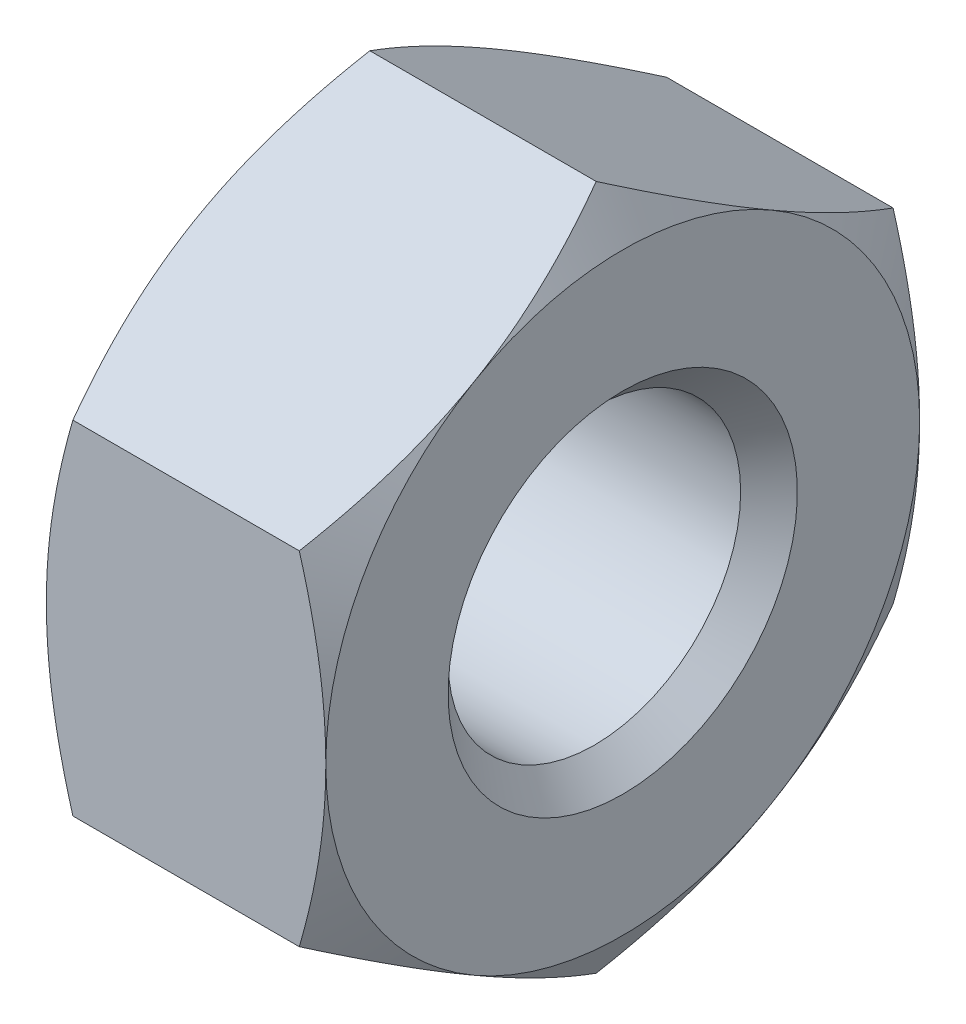
ISO-10303-21;
HEADER;
FILE_DESCRIPTION(('STEP AP214'),'2;1');
FILE_NAME('part.step','',(''),(''),'','','');
FILE_SCHEMA(('AUTOMOTIVE_DESIGN { 1 0 10303 214 1 1 1 1 }'));
ENDSEC;
DATA;
#1=APPLICATION_CONTEXT('core data for automotive mechanical design processes');
#2=APPLICATION_PROTOCOL_DEFINITION('international standard','automotive_design',2000,#1);
#3=PRODUCT_CONTEXT('',#1,'mechanical');
#4=PRODUCT('Part','Part','',(#3));
#5=PRODUCT_RELATED_PRODUCT_CATEGORY('part','',(#4));
#6=PRODUCT_DEFINITION_FORMATION('','',#4);
#7=PRODUCT_DEFINITION_CONTEXT('part definition',#1,'design');
#8=PRODUCT_DEFINITION('design','',#6,#7);
#9=PRODUCT_DEFINITION_SHAPE('','',#8);
#10=(LENGTH_UNIT() NAMED_UNIT(*) SI_UNIT(.MILLI.,.METRE.));
#11=(NAMED_UNIT(*) PLANE_ANGLE_UNIT() SI_UNIT($,.RADIAN.));
#12=(NAMED_UNIT(*) SI_UNIT($,.STERADIAN.) SOLID_ANGLE_UNIT());
#13=UNCERTAINTY_MEASURE_WITH_UNIT(LENGTH_MEASURE(1.E-05),#10,'distance_accuracy_value','');
#14=(GEOMETRIC_REPRESENTATION_CONTEXT(3) GLOBAL_UNCERTAINTY_ASSIGNED_CONTEXT((#13)) GLOBAL_UNIT_ASSIGNED_CONTEXT((#10,
#11,#12)) REPRESENTATION_CONTEXT('',''));
#15=CARTESIAN_POINT('',(0.,0.,0.));
#16=DIRECTION('',(0.,0.,1.));
#17=DIRECTION('',(1.,0.,0.));
#18=AXIS2_PLACEMENT_3D('',#15,#16,#17);
#19=DIRECTION('',(-0.707106781186548,0.707106781186547,0.));
#20=VECTOR('',#19,1.);
#21=CARTESIAN_POINT('',(-498995.,499000.,0.));
#22=LINE('',#21,#20);
#23=CARTESIAN_POINT('',(5.,0.,0.));
#24=DIRECTION('',(-1.,0.,0.));
#25=AXIS1_PLACEMENT('',#23,#24);
#26=SURFACE_OF_REVOLUTION('',#22,#25);
#27=CARTESIAN_POINT('',(0.812000000000001,0.,0.));
#28=DIRECTION('',(-1.,0.,0.));
#29=DIRECTION('',(0.,1.,0.));
#30=AXIS2_PLACEMENT_3D('',#27,#28,#29);
#31=CIRCLE('',#30,4.188);
#32=CARTESIAN_POINT('',(0.812000000000001,4.188,0.));
#33=VERTEX_POINT('',#32);
#34=EDGE_CURVE('E426',#33,#33,#31,.T.);
#35=ORIENTED_EDGE('',*,*,#34,.F.);
#36=EDGE_LOOP('',(#35));
#37=FACE_BOUND('',#36,.T.);
#38=CARTESIAN_POINT('',(0.,0.,0.));
#39=DIRECTION('',(-1.,0.,0.));
#40=DIRECTION('',(0.,1.,0.));
#41=AXIS2_PLACEMENT_3D('',#38,#39,#40);
#42=CIRCLE('',#41,5.);
#43=CARTESIAN_POINT('',(0.,5.,0.));
#44=VERTEX_POINT('',#43);
#45=EDGE_CURVE('E459',#44,#44,#42,.T.);
#46=ORIENTED_EDGE('',*,*,#45,.T.);
#47=EDGE_LOOP('',(#46));
#48=FACE_BOUND('',#47,.T.);
#49=ADVANCED_FACE('F17',(#37,#48),#26,.F.);
#50=CARTESIAN_POINT('',(0.,6.75,0.));
#51=DIRECTION('',(-1.,0.,0.));
#52=DIRECTION('',(0.,-1.,0.));
#53=AXIS2_PLACEMENT_3D('',#50,#51,#52);
#54=PLANE('',#53);
#55=CARTESIAN_POINT('',(0.,0.,0.));
#56=DIRECTION('',(-1.,0.,0.));
#57=DIRECTION('',(0.,1.,0.));
#58=AXIS2_PLACEMENT_3D('',#55,#56,#57);
#59=CIRCLE('',#58,8.5);
#60=CARTESIAN_POINT('',(0.,7.36121593216773,4.25));
#61=VERTEX_POINT('',#60);
#62=CARTESIAN_POINT('',(0.,7.36121593216773,-4.25));
#63=VERTEX_POINT('',#62);
#64=EDGE_CURVE('E11',#61,#63,#59,.T.);
#65=ORIENTED_EDGE('',*,*,#64,.T.);
#66=CARTESIAN_POINT('',(0.,0.,0.));
#67=DIRECTION('',(-1.,0.,0.));
#68=DIRECTION('',(0.,1.,0.));
#69=AXIS2_PLACEMENT_3D('',#66,#67,#68);
#70=CIRCLE('',#69,8.5);
#71=CARTESIAN_POINT('',(0.,0.,-8.5));
#72=VERTEX_POINT('',#71);
#73=EDGE_CURVE('E27',#63,#72,#70,.T.);
#74=ORIENTED_EDGE('',*,*,#73,.T.);
#75=CARTESIAN_POINT('',(0.,0.,0.));
#76=DIRECTION('',(-1.,0.,0.));
#77=DIRECTION('',(0.,1.,0.));
#78=AXIS2_PLACEMENT_3D('',#75,#76,#77);
#79=CIRCLE('',#78,8.5);
#80=CARTESIAN_POINT('',(0.,-7.36121593216773,-4.25));
#81=VERTEX_POINT('',#80);
#82=EDGE_CURVE('E161',#72,#81,#79,.T.);
#83=ORIENTED_EDGE('',*,*,#82,.T.);
#84=CARTESIAN_POINT('',(0.,0.,0.));
#85=DIRECTION('',(-1.,0.,0.));
#86=DIRECTION('',(0.,1.,0.));
#87=AXIS2_PLACEMENT_3D('',#84,#85,#86);
#88=CIRCLE('',#87,8.5);
#89=CARTESIAN_POINT('',(0.,-7.36121593216773,4.25));
#90=VERTEX_POINT('',#89);
#91=EDGE_CURVE('E363',#81,#90,#88,.T.);
#92=ORIENTED_EDGE('',*,*,#91,.T.);
#93=CARTESIAN_POINT('',(0.,0.,0.));
#94=DIRECTION('',(-1.,0.,0.));
#95=DIRECTION('',(0.,1.,0.));
#96=AXIS2_PLACEMENT_3D('',#93,#94,#95);
#97=CIRCLE('',#96,8.5);
#98=CARTESIAN_POINT('',(0.,0.,8.5));
#99=VERTEX_POINT('',#98);
#100=EDGE_CURVE('E366',#90,#99,#97,.T.);
#101=ORIENTED_EDGE('',*,*,#100,.T.);
#102=CARTESIAN_POINT('',(0.,0.,0.));
#103=DIRECTION('',(-1.,0.,0.));
#104=DIRECTION('',(0.,1.,0.));
#105=AXIS2_PLACEMENT_3D('',#102,#103,#104);
#106=CIRCLE('',#105,8.5);
#107=EDGE_CURVE('E362',#99,#61,#106,.T.);
#108=ORIENTED_EDGE('',*,*,#107,.T.);
#109=EDGE_LOOP('',(#65,#74,#83,#92,#101,#108));
#110=FACE_BOUND('',#109,.T.);
#111=ORIENTED_EDGE('',*,*,#45,.F.);
#112=EDGE_LOOP('',(#111));
#113=FACE_BOUND('',#112,.T.);
#114=ADVANCED_FACE('F180',(#110,#113),#54,.T.);
#115=CARTESIAN_POINT('',(8.,6.75,0.));
#116=DIRECTION('',(1.,0.,0.));
#117=DIRECTION('',(0.,0.,-1.));
#118=AXIS2_PLACEMENT_3D('',#115,#116,#117);
#119=PLANE('',#118);
#120=CARTESIAN_POINT('',(8.,0.,0.));
#121=DIRECTION('',(-1.,0.,0.));
#122=DIRECTION('',(0.,1.,0.));
#123=AXIS2_PLACEMENT_3D('',#120,#121,#122);
#124=CIRCLE('',#123,5.);
#125=CARTESIAN_POINT('',(8.,5.,0.));
#126=VERTEX_POINT('',#125);
#127=EDGE_CURVE('E356',#126,#126,#124,.T.);
#128=ORIENTED_EDGE('',*,*,#127,.T.);
#129=EDGE_LOOP('',(#128));
#130=FACE_BOUND('',#129,.T.);
#131=CARTESIAN_POINT('',(8.,0.,0.));
#132=DIRECTION('',(-1.,0.,0.));
#133=DIRECTION('',(0.,1.,0.));
#134=AXIS2_PLACEMENT_3D('',#131,#132,#133);
#135=CIRCLE('',#134,8.5);
#136=CARTESIAN_POINT('',(8.,7.36121593216773,4.25));
#137=VERTEX_POINT('',#136);
#138=CARTESIAN_POINT('',(8.,7.36121593216773,-4.25));
#139=VERTEX_POINT('',#138);
#140=EDGE_CURVE('E372',#137,#139,#135,.T.);
#141=ORIENTED_EDGE('',*,*,#140,.F.);
#142=CARTESIAN_POINT('',(8.,0.,0.));
#143=DIRECTION('',(-1.,0.,0.));
#144=DIRECTION('',(0.,1.,0.));
#145=AXIS2_PLACEMENT_3D('',#142,#143,#144);
#146=CIRCLE('',#145,8.5);
#147=CARTESIAN_POINT('',(8.,0.,8.5));
#148=VERTEX_POINT('',#147);
#149=EDGE_CURVE('E408',#148,#137,#146,.T.);
#150=ORIENTED_EDGE('',*,*,#149,.F.);
#151=CARTESIAN_POINT('',(8.,0.,0.));
#152=DIRECTION('',(-1.,0.,0.));
#153=DIRECTION('',(0.,1.,0.));
#154=AXIS2_PLACEMENT_3D('',#151,#152,#153);
#155=CIRCLE('',#154,8.5);
#156=CARTESIAN_POINT('',(8.,-7.36121593216773,4.25));
#157=VERTEX_POINT('',#156);
#158=EDGE_CURVE('E131',#157,#148,#155,.T.);
#159=ORIENTED_EDGE('',*,*,#158,.F.);
#160=CARTESIAN_POINT('',(8.,0.,0.));
#161=DIRECTION('',(-1.,0.,0.));
#162=DIRECTION('',(0.,1.,0.));
#163=AXIS2_PLACEMENT_3D('',#160,#161,#162);
#164=CIRCLE('',#163,8.5);
#165=CARTESIAN_POINT('',(8.,-7.36121593216773,-4.25));
#166=VERTEX_POINT('',#165);
#167=EDGE_CURVE('E105',#166,#157,#164,.T.);
#168=ORIENTED_EDGE('',*,*,#167,.F.);
#169=CARTESIAN_POINT('',(8.,0.,0.));
#170=DIRECTION('',(-1.,0.,0.));
#171=DIRECTION('',(0.,1.,0.));
#172=AXIS2_PLACEMENT_3D('',#169,#170,#171);
#173=CIRCLE('',#172,8.5);
#174=CARTESIAN_POINT('',(8.,0.,-8.5));
#175=VERTEX_POINT('',#174);
#176=EDGE_CURVE('E120',#175,#166,#173,.T.);
#177=ORIENTED_EDGE('',*,*,#176,.F.);
#178=CARTESIAN_POINT('',(8.,0.,0.));
#179=DIRECTION('',(-1.,0.,0.));
#180=DIRECTION('',(0.,1.,0.));
#181=AXIS2_PLACEMENT_3D('',#178,#179,#180);
#182=CIRCLE('',#181,8.5);
#183=EDGE_CURVE('E427',#139,#175,#182,.T.);
#184=ORIENTED_EDGE('',*,*,#183,.F.);
#185=EDGE_LOOP('',(#141,#150,#159,#168,#177,#184));
#186=FACE_BOUND('',#185,.T.);
#187=ADVANCED_FACE('F128',(#130,#186),#119,.T.);
#188=DIRECTION('',(0.707106781186548,0.707106781186547,0.));
#189=VECTOR('',#188,1.);
#190=CARTESIAN_POINT('',(499000.,498996.999999999,0.));
#191=LINE('',#190,#189);
#192=CARTESIAN_POINT('',(2.99999999999999,0.,0.));
#193=DIRECTION('',(1.,0.,0.));
#194=AXIS1_PLACEMENT('',#192,#193);
#195=SURFACE_OF_REVOLUTION('',#191,#194);
#196=ORIENTED_EDGE('',*,*,#127,.F.);
#197=EDGE_LOOP('',(#196));
#198=FACE_BOUND('',#197,.T.);
#199=CARTESIAN_POINT('',(7.188,0.,0.));
#200=DIRECTION('',(-1.,0.,0.));
#201=DIRECTION('',(0.,1.,0.));
#202=AXIS2_PLACEMENT_3D('',#199,#200,#201);
#203=CIRCLE('',#202,4.188);
#204=CARTESIAN_POINT('',(7.188,4.188,0.));
#205=VERTEX_POINT('',#204);
#206=EDGE_CURVE('E155',#205,#205,#203,.T.);
#207=ORIENTED_EDGE('',*,*,#206,.T.);
#208=EDGE_LOOP('',(#207));
#209=FACE_BOUND('',#208,.T.);
#210=ADVANCED_FACE('F187',(#198,#209),#195,.F.);
#211=CARTESIAN_POINT('',(4.,0.,0.));
#212=DIRECTION('',(1.,0.,0.));
#213=DIRECTION('',(0.,1.,0.));
#214=AXIS2_PLACEMENT_3D('',#211,#212,#213);
#215=CIRCLE('',#214,4.188);
#216=DIRECTION('',(-1.,0.,0.));
#217=VECTOR('',#216,1.);
#218=SURFACE_OF_LINEAR_EXTRUSION('',#215,#217);
#219=ORIENTED_EDGE('',*,*,#206,.F.);
#220=EDGE_LOOP('',(#219));
#221=FACE_BOUND('',#220,.T.);
#222=ORIENTED_EDGE('',*,*,#34,.T.);
#223=EDGE_LOOP('',(#222));
#224=FACE_BOUND('',#223,.T.);
#225=ADVANCED_FACE('F191',(#221,#224),#218,.T.);
#226=DIRECTION('',(0.5,-0.866025403784439,0.));
#227=VECTOR('',#226,1.);
#228=CARTESIAN_POINT('',(6.,11.9641016151378,0.));
#229=LINE('',#228,#227);
#230=CARTESIAN_POINT('',(12.9074772881118,0.,0.));
#231=DIRECTION('',(-1.,0.,0.));
#232=AXIS1_PLACEMENT('',#230,#231);
#233=SURFACE_OF_REVOLUTION('',#229,#232);
#234=CARTESIAN_POINT('',(8.,7.36121593216773,4.25));
#235=CARTESIAN_POINT('',(8.,6.22243186433611,6.22243186433433));
#236=CARTESIAN_POINT('',(7.24081062144515,4.90747728811182,8.5));
#237=(BOUNDED_CURVE() B_SPLINE_CURVE(2,(#234,#235,#236),.UNSPECIFIED.,.F.,
.F.) B_SPLINE_CURVE_WITH_KNOTS((3,3),(13.5657361030764,19.7429184940877),
.UNSPECIFIED.) CURVE() GEOMETRIC_REPRESENTATION_ITEM() RATIONAL_B_SPLINE_CURVE((1.,
1.08487688643119,1.09245608635531)) REPRESENTATION_ITEM(''));
#238=CARTESIAN_POINT('',(7.24081062144515,4.90747728811182,8.5));
#239=VERTEX_POINT('',#238);
#240=EDGE_CURVE('E147',#137,#239,#237,.T.);
#241=ORIENTED_EDGE('',*,*,#240,.T.);
#242=CARTESIAN_POINT('',(7.24081062144515,4.90747728811182,8.5));
#243=CARTESIAN_POINT('',(8.,2.27756813566324,8.5));
#244=CARTESIAN_POINT('',(8.,0.,8.5));
#245=(BOUNDED_CURVE() B_SPLINE_CURVE(2,(#242,#243,#244),.UNSPECIFIED.,.F.,
.F.) B_SPLINE_CURVE_WITH_KNOTS((3,3),(7.38855371206508,13.5657361030764),
.UNSPECIFIED.) CURVE() GEOMETRIC_REPRESENTATION_ITEM() RATIONAL_B_SPLINE_CURVE((1.09245608635531,
1.08487688643119,1.)) REPRESENTATION_ITEM(''));
#246=EDGE_CURVE('E138',#239,#148,#245,.T.);
#247=ORIENTED_EDGE('',*,*,#246,.T.);
#248=ORIENTED_EDGE('',*,*,#149,.T.);
#249=EDGE_LOOP('',(#241,#247,#248));
#250=FACE_BOUND('',#249,.T.);
#251=ADVANCED_FACE('F195',(#250),#233,.F.);
#252=DIRECTION('',(0.5,-0.866025403784439,0.));
#253=VECTOR('',#252,1.);
#254=CARTESIAN_POINT('',(6.,11.9641016151378,0.));
#255=LINE('',#254,#253);
#256=CARTESIAN_POINT('',(12.9074772881118,0.,0.));
#257=DIRECTION('',(-1.,0.,0.));
#258=AXIS1_PLACEMENT('',#256,#257);
#259=SURFACE_OF_REVOLUTION('',#255,#258);
#260=CARTESIAN_POINT('',(8.,7.36121593216773,-4.25));
#261=CARTESIAN_POINT('',(8.,8.49999999999935,-2.27756813566567));
#262=CARTESIAN_POINT('',(7.24081062144515,9.81495457622364,0.));
#263=(BOUNDED_CURVE() B_SPLINE_CURVE(2,(#260,#261,#262),.UNSPECIFIED.,.F.,
.F.) B_SPLINE_CURVE_WITH_KNOTS((3,3),(13.5657361030764,19.7429184940877),
.UNSPECIFIED.) CURVE() GEOMETRIC_REPRESENTATION_ITEM() RATIONAL_B_SPLINE_CURVE((1.,
1.08487688643119,1.09245608635531)) REPRESENTATION_ITEM(''));
#264=CARTESIAN_POINT('',(7.24081062144515,9.81495457622364,0.));
#265=VERTEX_POINT('',#264);
#266=EDGE_CURVE('E384',#139,#265,#263,.T.);
#267=ORIENTED_EDGE('',*,*,#266,.T.);
#268=CARTESIAN_POINT('',(7.24081062144515,9.81495457622364,0.));
#269=CARTESIAN_POINT('',(8.,8.49999999999935,2.27756813566567));
#270=CARTESIAN_POINT('',(8.,7.36121593216773,4.25));
#271=(BOUNDED_CURVE() B_SPLINE_CURVE(2,(#268,#269,#270),.UNSPECIFIED.,.F.,
.F.) B_SPLINE_CURVE_WITH_KNOTS((3,3),(7.38855371206508,13.5657361030764),
.UNSPECIFIED.) CURVE() GEOMETRIC_REPRESENTATION_ITEM() RATIONAL_B_SPLINE_CURVE((1.09245608635531,
1.08487688643119,1.)) REPRESENTATION_ITEM(''));
#272=EDGE_CURVE('E380',#265,#137,#271,.T.);
#273=ORIENTED_EDGE('',*,*,#272,.T.);
#274=ORIENTED_EDGE('',*,*,#140,.T.);
#275=EDGE_LOOP('',(#267,#273,#274));
#276=FACE_BOUND('',#275,.T.);
#277=ADVANCED_FACE('F206',(#276),#259,.F.);
#278=DIRECTION('',(0.5,-0.866025403784439,0.));
#279=VECTOR('',#278,1.);
#280=CARTESIAN_POINT('',(6.,11.9641016151378,0.));
#281=LINE('',#280,#279);
#282=CARTESIAN_POINT('',(12.9074772881118,0.,0.));
#283=DIRECTION('',(-1.,0.,0.));
#284=AXIS1_PLACEMENT('',#282,#283);
#285=SURFACE_OF_REVOLUTION('',#281,#284);
#286=CARTESIAN_POINT('',(8.,0.,-8.5));
#287=CARTESIAN_POINT('',(8.,2.27756813566324,-8.5));
#288=CARTESIAN_POINT('',(7.24081062144515,4.90747728811182,-8.5));
#289=(BOUNDED_CURVE() B_SPLINE_CURVE(2,(#286,#287,#288),.UNSPECIFIED.,.F.,
.F.) B_SPLINE_CURVE_WITH_KNOTS((3,3),(13.5657361030764,19.7429184940877),
.UNSPECIFIED.) CURVE() GEOMETRIC_REPRESENTATION_ITEM() RATIONAL_B_SPLINE_CURVE((1.,
1.08487688643119,1.09245608635531)) REPRESENTATION_ITEM(''));
#290=CARTESIAN_POINT('',(7.24081062144515,4.90747728811182,-8.5));
#291=VERTEX_POINT('',#290);
#292=EDGE_CURVE('E367',#175,#291,#289,.T.);
#293=ORIENTED_EDGE('',*,*,#292,.T.);
#294=CARTESIAN_POINT('',(7.24081062144515,4.90747728811182,-8.5));
#295=CARTESIAN_POINT('',(8.,6.22243186433611,-6.22243186433433));
#296=CARTESIAN_POINT('',(8.,7.36121593216773,-4.25));
#297=(BOUNDED_CURVE() B_SPLINE_CURVE(2,(#294,#295,#296),.UNSPECIFIED.,.F.,
.F.) B_SPLINE_CURVE_WITH_KNOTS((3,3),(7.38855371206508,13.5657361030764),
.UNSPECIFIED.) CURVE() GEOMETRIC_REPRESENTATION_ITEM() RATIONAL_B_SPLINE_CURVE((1.09245608635531,
1.08487688643119,1.)) REPRESENTATION_ITEM(''));
#298=EDGE_CURVE('E299',#291,#139,#297,.T.);
#299=ORIENTED_EDGE('',*,*,#298,.T.);
#300=ORIENTED_EDGE('',*,*,#183,.T.);
#301=EDGE_LOOP('',(#293,#299,#300));
#302=FACE_BOUND('',#301,.T.);
#303=ADVANCED_FACE('F209',(#302),#285,.F.);
#304=DIRECTION('',(0.5,-0.866025403784439,0.));
#305=VECTOR('',#304,1.);
#306=CARTESIAN_POINT('',(6.,11.9641016151378,0.));
#307=LINE('',#306,#305);
#308=CARTESIAN_POINT('',(12.9074772881118,0.,0.));
#309=DIRECTION('',(-1.,0.,0.));
#310=AXIS1_PLACEMENT('',#308,#309);
#311=SURFACE_OF_REVOLUTION('',#307,#310);
#312=CARTESIAN_POINT('',(7.24081062144515,-4.90747728811182,-8.5));
#313=CARTESIAN_POINT('',(8.,-2.27756813566324,-8.5));
#314=CARTESIAN_POINT('',(8.,0.,-8.5));
#315=(BOUNDED_CURVE() B_SPLINE_CURVE(2,(#312,#313,#314),.UNSPECIFIED.,.F.,
.F.) B_SPLINE_CURVE_WITH_KNOTS((3,3),(7.38855371206508,13.5657361030764),
.UNSPECIFIED.) CURVE() GEOMETRIC_REPRESENTATION_ITEM() RATIONAL_B_SPLINE_CURVE((1.09245608635531,
1.08487688643119,1.)) REPRESENTATION_ITEM(''));
#316=CARTESIAN_POINT('',(7.24081062144515,-4.90747728811182,-8.5));
#317=VERTEX_POINT('',#316);
#318=EDGE_CURVE('E124',#317,#175,#315,.T.);
#319=ORIENTED_EDGE('',*,*,#318,.T.);
#320=ORIENTED_EDGE('',*,*,#176,.T.);
#321=CARTESIAN_POINT('',(8.,-7.36121593216773,-4.25));
#322=CARTESIAN_POINT('',(8.,-6.22243186433611,-6.22243186433432));
#323=CARTESIAN_POINT('',(7.24081062144515,-4.90747728811182,-8.5));
#324=(BOUNDED_CURVE() B_SPLINE_CURVE(2,(#321,#322,#323),.UNSPECIFIED.,.F.,
.F.) B_SPLINE_CURVE_WITH_KNOTS((3,3),(13.5657361030764,19.7429184940877),
.UNSPECIFIED.) CURVE() GEOMETRIC_REPRESENTATION_ITEM() RATIONAL_B_SPLINE_CURVE((1.,
1.08487688643119,1.09245608635531)) REPRESENTATION_ITEM(''));
#325=EDGE_CURVE('E111',#166,#317,#324,.T.);
#326=ORIENTED_EDGE('',*,*,#325,.T.);
#327=EDGE_LOOP('',(#319,#320,#326));
#328=FACE_BOUND('',#327,.T.);
#329=ADVANCED_FACE('F123',(#328),#311,.F.);
#330=DIRECTION('',(0.5,-0.866025403784439,0.));
#331=VECTOR('',#330,1.);
#332=CARTESIAN_POINT('',(6.,11.9641016151378,0.));
#333=LINE('',#332,#331);
#334=CARTESIAN_POINT('',(12.9074772881118,0.,0.));
#335=DIRECTION('',(-1.,0.,0.));
#336=AXIS1_PLACEMENT('',#334,#335);
#337=SURFACE_OF_REVOLUTION('',#333,#336);
#338=CARTESIAN_POINT('',(7.24081062144515,-9.81495457622364,0.));
#339=CARTESIAN_POINT('',(8.,-8.49999999999935,-2.27756813566568));
#340=CARTESIAN_POINT('',(8.,-7.36121593216773,-4.25));
#341=(BOUNDED_CURVE() B_SPLINE_CURVE(2,(#338,#339,#340),.UNSPECIFIED.,.F.,
.F.) B_SPLINE_CURVE_WITH_KNOTS((3,3),(7.38855371206508,13.5657361030764),
.UNSPECIFIED.) CURVE() GEOMETRIC_REPRESENTATION_ITEM() RATIONAL_B_SPLINE_CURVE((1.09245608635531,
1.08487688643119,1.)) REPRESENTATION_ITEM(''));
#342=CARTESIAN_POINT('',(7.24081062144515,-9.81495457622364,0.));
#343=VERTEX_POINT('',#342);
#344=EDGE_CURVE('E101',#343,#166,#341,.T.);
#345=ORIENTED_EDGE('',*,*,#344,.T.);
#346=ORIENTED_EDGE('',*,*,#167,.T.);
#347=CARTESIAN_POINT('',(8.,-7.36121593216773,4.25));
#348=CARTESIAN_POINT('',(8.,-8.49999999999935,2.27756813566568));
#349=CARTESIAN_POINT('',(7.24081062144515,-9.81495457622364,0.));
#350=(BOUNDED_CURVE() B_SPLINE_CURVE(2,(#347,#348,#349),.UNSPECIFIED.,.F.,
.F.) B_SPLINE_CURVE_WITH_KNOTS((3,3),(13.5657361030764,19.7429184940877),
.UNSPECIFIED.) CURVE() GEOMETRIC_REPRESENTATION_ITEM() RATIONAL_B_SPLINE_CURVE((1.,
1.08487688643119,1.09245608635531)) REPRESENTATION_ITEM(''));
#351=EDGE_CURVE('E107',#157,#343,#350,.T.);
#352=ORIENTED_EDGE('',*,*,#351,.T.);
#353=EDGE_LOOP('',(#345,#346,#352));
#354=FACE_BOUND('',#353,.T.);
#355=ADVANCED_FACE('F103',(#354),#337,.F.);
#356=DIRECTION('',(0.5,-0.866025403784439,0.));
#357=VECTOR('',#356,1.);
#358=CARTESIAN_POINT('',(6.,11.9641016151378,0.));
#359=LINE('',#358,#357);
#360=CARTESIAN_POINT('',(12.9074772881118,0.,0.));
#361=DIRECTION('',(-1.,0.,0.));
#362=AXIS1_PLACEMENT('',#360,#361);
#363=SURFACE_OF_REVOLUTION('',#359,#362);
#364=CARTESIAN_POINT('',(7.24081062144515,-4.90747728811182,8.5));
#365=CARTESIAN_POINT('',(8.,-6.22243186433611,6.22243186433433));
#366=CARTESIAN_POINT('',(8.,-7.36121593216773,4.25));
#367=(BOUNDED_CURVE() B_SPLINE_CURVE(2,(#364,#365,#366),.UNSPECIFIED.,.F.,
.F.) B_SPLINE_CURVE_WITH_KNOTS((3,3),(7.38855371206508,13.5657361030764),
.UNSPECIFIED.) CURVE() GEOMETRIC_REPRESENTATION_ITEM() RATIONAL_B_SPLINE_CURVE((1.09245608635531,
1.08487688643119,1.)) REPRESENTATION_ITEM(''));
#368=CARTESIAN_POINT('',(7.24081062144515,-4.90747728811182,8.5));
#369=VERTEX_POINT('',#368);
#370=EDGE_CURVE('E134',#369,#157,#367,.T.);
#371=ORIENTED_EDGE('',*,*,#370,.T.);
#372=ORIENTED_EDGE('',*,*,#158,.T.);
#373=CARTESIAN_POINT('',(8.,0.,8.5));
#374=CARTESIAN_POINT('',(8.,-2.27756813566324,8.5));
#375=CARTESIAN_POINT('',(7.24081062144515,-4.90747728811182,8.5));
#376=(BOUNDED_CURVE() B_SPLINE_CURVE(2,(#373,#374,#375),.UNSPECIFIED.,.F.,
.F.) B_SPLINE_CURVE_WITH_KNOTS((3,3),(13.5657361030764,19.7429184940877),
.UNSPECIFIED.) CURVE() GEOMETRIC_REPRESENTATION_ITEM() RATIONAL_B_SPLINE_CURVE((1.,
1.08487688643119,1.09245608635531)) REPRESENTATION_ITEM(''));
#377=EDGE_CURVE('E335',#148,#369,#376,.T.);
#378=ORIENTED_EDGE('',*,*,#377,.T.);
#379=EDGE_LOOP('',(#371,#372,#378));
#380=FACE_BOUND('',#379,.T.);
#381=ADVANCED_FACE('F225',(#380),#363,.F.);
#382=DIRECTION('',(-0.5,-0.866025403784439,0.));
#383=VECTOR('',#382,1.);
#384=CARTESIAN_POINT('',(2.,11.9641016151378,0.));
#385=LINE('',#384,#383);
#386=CARTESIAN_POINT('',(-4.90747728811182,0.,0.));
#387=DIRECTION('',(1.,0.,0.));
#388=AXIS1_PLACEMENT('',#386,#387);
#389=SURFACE_OF_REVOLUTION('',#385,#388);
#390=CARTESIAN_POINT('',(0.,7.36121593216773,4.25));
#391=CARTESIAN_POINT('',(0.,8.49999999999935,2.27756813566567));
#392=CARTESIAN_POINT('',(0.759189378554848,9.81495457622364,0.));
#393=(BOUNDED_CURVE() B_SPLINE_CURVE(2,(#390,#391,#392),.UNSPECIFIED.,.F.,
.F.) B_SPLINE_CURVE_WITH_KNOTS((3,3),(13.5657361030764,19.7429184940877),
.UNSPECIFIED.) CURVE() GEOMETRIC_REPRESENTATION_ITEM() RATIONAL_B_SPLINE_CURVE((1.,
1.08487688643119,1.09245608635531)) REPRESENTATION_ITEM(''));
#394=CARTESIAN_POINT('',(0.759189378554848,9.81495457622364,0.));
#395=VERTEX_POINT('',#394);
#396=EDGE_CURVE('E284',#61,#395,#393,.T.);
#397=ORIENTED_EDGE('',*,*,#396,.T.);
#398=CARTESIAN_POINT('',(0.759189378554848,9.81495457622364,0.));
#399=CARTESIAN_POINT('',(0.,8.49999999999935,-2.27756813566567));
#400=CARTESIAN_POINT('',(0.,7.36121593216773,-4.25));
#401=(BOUNDED_CURVE() B_SPLINE_CURVE(2,(#398,#399,#400),.UNSPECIFIED.,.F.,
.F.) B_SPLINE_CURVE_WITH_KNOTS((3,3),(7.38855371206509,13.5657361030764),
.UNSPECIFIED.) CURVE() GEOMETRIC_REPRESENTATION_ITEM() RATIONAL_B_SPLINE_CURVE((1.09245608635531,
1.08487688643119,1.)) REPRESENTATION_ITEM(''));
#402=EDGE_CURVE('E291',#395,#63,#401,.T.);
#403=ORIENTED_EDGE('',*,*,#402,.T.);
#404=ORIENTED_EDGE('',*,*,#64,.F.);
#405=EDGE_LOOP('',(#397,#403,#404));
#406=FACE_BOUND('',#405,.T.);
#407=ADVANCED_FACE('F228',(#406),#389,.F.);
#408=DIRECTION('',(-0.5,-0.866025403784439,0.));
#409=VECTOR('',#408,1.);
#410=CARTESIAN_POINT('',(2.,11.9641016151378,0.));
#411=LINE('',#410,#409);
#412=CARTESIAN_POINT('',(-4.90747728811182,0.,0.));
#413=DIRECTION('',(1.,0.,0.));
#414=AXIS1_PLACEMENT('',#412,#413);
#415=SURFACE_OF_REVOLUTION('',#411,#414);
#416=CARTESIAN_POINT('',(0.,0.,8.5));
#417=CARTESIAN_POINT('',(0.,2.27756813566324,8.5));
#418=CARTESIAN_POINT('',(0.759189378554847,4.90747728811182,8.5));
#419=(BOUNDED_CURVE() B_SPLINE_CURVE(2,(#416,#417,#418),.UNSPECIFIED.,.F.,
.F.) B_SPLINE_CURVE_WITH_KNOTS((3,3),(13.5657361030764,19.7429184940877),
.UNSPECIFIED.) CURVE() GEOMETRIC_REPRESENTATION_ITEM() RATIONAL_B_SPLINE_CURVE((1.,
1.08487688643119,1.09245608635531)) REPRESENTATION_ITEM(''));
#420=CARTESIAN_POINT('',(0.759189378554847,4.90747728811182,8.5));
#421=VERTEX_POINT('',#420);
#422=EDGE_CURVE('E288',#99,#421,#419,.T.);
#423=ORIENTED_EDGE('',*,*,#422,.T.);
#424=CARTESIAN_POINT('',(0.759189378554847,4.90747728811182,8.5));
#425=CARTESIAN_POINT('',(0.,6.22243186433611,6.22243186433433));
#426=CARTESIAN_POINT('',(0.,7.36121593216773,4.25));
#427=(BOUNDED_CURVE() B_SPLINE_CURVE(2,(#424,#425,#426),.UNSPECIFIED.,.F.,
.F.) B_SPLINE_CURVE_WITH_KNOTS((3,3),(7.38855371206508,13.5657361030764),
.UNSPECIFIED.) CURVE() GEOMETRIC_REPRESENTATION_ITEM() RATIONAL_B_SPLINE_CURVE((1.09245608635531,
1.08487688643119,1.)) REPRESENTATION_ITEM(''));
#428=EDGE_CURVE('E279',#421,#61,#427,.T.);
#429=ORIENTED_EDGE('',*,*,#428,.T.);
#430=ORIENTED_EDGE('',*,*,#107,.F.);
#431=EDGE_LOOP('',(#423,#429,#430));
#432=FACE_BOUND('',#431,.T.);
#433=ADVANCED_FACE('F232',(#432),#415,.F.);
#434=DIRECTION('',(-0.5,-0.866025403784439,0.));
#435=VECTOR('',#434,1.);
#436=CARTESIAN_POINT('',(2.,11.9641016151378,0.));
#437=LINE('',#436,#435);
#438=CARTESIAN_POINT('',(-4.90747728811182,0.,0.));
#439=DIRECTION('',(1.,0.,0.));
#440=AXIS1_PLACEMENT('',#438,#439);
#441=SURFACE_OF_REVOLUTION('',#437,#440);
#442=CARTESIAN_POINT('',(0.,-7.36121593216773,4.25));
#443=CARTESIAN_POINT('',(0.,-6.22243186433611,6.22243186433433));
#444=CARTESIAN_POINT('',(0.759189378554847,-4.90747728811182,8.5));
#445=(BOUNDED_CURVE() B_SPLINE_CURVE(2,(#442,#443,#444),.UNSPECIFIED.,.F.,
.F.) B_SPLINE_CURVE_WITH_KNOTS((3,3),(13.5657361030764,19.7429184940877),
.UNSPECIFIED.) CURVE() GEOMETRIC_REPRESENTATION_ITEM() RATIONAL_B_SPLINE_CURVE((1.,
1.08487688643119,1.09245608635531)) REPRESENTATION_ITEM(''));
#446=CARTESIAN_POINT('',(0.759189378554847,-4.90747728811182,8.5));
#447=VERTEX_POINT('',#446);
#448=EDGE_CURVE('E289',#90,#447,#445,.T.);
#449=ORIENTED_EDGE('',*,*,#448,.T.);
#450=CARTESIAN_POINT('',(0.759189378554847,-4.90747728811182,8.5));
#451=CARTESIAN_POINT('',(0.,-2.27756813566325,8.5));
#452=CARTESIAN_POINT('',(0.,0.,8.5));
#453=(BOUNDED_CURVE() B_SPLINE_CURVE(2,(#450,#451,#452),.UNSPECIFIED.,.F.,
.F.) B_SPLINE_CURVE_WITH_KNOTS((3,3),(7.38855371206509,13.5657361030764),
.UNSPECIFIED.) CURVE() GEOMETRIC_REPRESENTATION_ITEM() RATIONAL_B_SPLINE_CURVE((1.09245608635532,
1.08487688643119,1.)) REPRESENTATION_ITEM(''));
#454=EDGE_CURVE('E294',#447,#99,#453,.T.);
#455=ORIENTED_EDGE('',*,*,#454,.T.);
#456=ORIENTED_EDGE('',*,*,#100,.F.);
#457=EDGE_LOOP('',(#449,#455,#456));
#458=FACE_BOUND('',#457,.T.);
#459=ADVANCED_FACE('F236',(#458),#441,.F.);
#460=DIRECTION('',(-0.5,-0.866025403784439,0.));
#461=VECTOR('',#460,1.);
#462=CARTESIAN_POINT('',(2.,11.9641016151378,0.));
#463=LINE('',#462,#461);
#464=CARTESIAN_POINT('',(-4.90747728811182,0.,0.));
#465=DIRECTION('',(1.,0.,0.));
#466=AXIS1_PLACEMENT('',#464,#465);
#467=SURFACE_OF_REVOLUTION('',#463,#466);
#468=CARTESIAN_POINT('',(0.759189378554847,-9.81495457622364,0.));
#469=CARTESIAN_POINT('',(0.,-8.49999999999935,2.27756813566567));
#470=CARTESIAN_POINT('',(0.,-7.36121593216773,4.25));
#471=(BOUNDED_CURVE() B_SPLINE_CURVE(2,(#468,#469,#470),.UNSPECIFIED.,.F.,
.F.) B_SPLINE_CURVE_WITH_KNOTS((3,3),(7.38855371206509,13.5657361030764),
.UNSPECIFIED.) CURVE() GEOMETRIC_REPRESENTATION_ITEM() RATIONAL_B_SPLINE_CURVE((1.09245608635531,
1.08487688643119,1.)) REPRESENTATION_ITEM(''));
#472=CARTESIAN_POINT('',(0.759189378554847,-9.81495457622364,0.));
#473=VERTEX_POINT('',#472);
#474=EDGE_CURVE('E316',#473,#90,#471,.T.);
#475=ORIENTED_EDGE('',*,*,#474,.T.);
#476=ORIENTED_EDGE('',*,*,#91,.F.);
#477=CARTESIAN_POINT('',(0.,-7.36121593216773,-4.25));
#478=CARTESIAN_POINT('',(0.,-8.49999999999935,-2.27756813566567));
#479=CARTESIAN_POINT('',(0.759189378554847,-9.81495457622364,0.));
#480=(BOUNDED_CURVE() B_SPLINE_CURVE(2,(#477,#478,#479),.UNSPECIFIED.,.F.,
.F.) B_SPLINE_CURVE_WITH_KNOTS((3,3),(13.5657361030764,19.7429184940877),
.UNSPECIFIED.) CURVE() GEOMETRIC_REPRESENTATION_ITEM() RATIONAL_B_SPLINE_CURVE((1.,
1.08487688643119,1.09245608635531)) REPRESENTATION_ITEM(''));
#481=EDGE_CURVE('E167',#81,#473,#480,.T.);
#482=ORIENTED_EDGE('',*,*,#481,.T.);
#483=EDGE_LOOP('',(#475,#476,#482));
#484=FACE_BOUND('',#483,.T.);
#485=ADVANCED_FACE('F245',(#484),#467,.F.);
#486=DIRECTION('',(-0.5,-0.866025403784439,0.));
#487=VECTOR('',#486,1.);
#488=CARTESIAN_POINT('',(2.,11.9641016151378,0.));
#489=LINE('',#488,#487);
#490=CARTESIAN_POINT('',(-4.90747728811182,0.,0.));
#491=DIRECTION('',(1.,0.,0.));
#492=AXIS1_PLACEMENT('',#490,#491);
#493=SURFACE_OF_REVOLUTION('',#489,#492);
#494=CARTESIAN_POINT('',(0.759189378554847,-4.90747728811182,-8.5));
#495=CARTESIAN_POINT('',(0.,-6.2224318643361,-6.22243186433434));
#496=CARTESIAN_POINT('',(0.,-7.36121593216773,-4.25));
#497=(BOUNDED_CURVE() B_SPLINE_CURVE(2,(#494,#495,#496),.UNSPECIFIED.,.F.,
.F.) B_SPLINE_CURVE_WITH_KNOTS((3,3),(7.38855371206509,13.5657361030764),
.UNSPECIFIED.) CURVE() GEOMETRIC_REPRESENTATION_ITEM() RATIONAL_B_SPLINE_CURVE((1.09245608635532,
1.0848768864312,1.)) REPRESENTATION_ITEM(''));
#498=CARTESIAN_POINT('',(0.759189378554847,-4.90747728811182,-8.5));
#499=VERTEX_POINT('',#498);
#500=EDGE_CURVE('E162',#499,#81,#497,.T.);
#501=ORIENTED_EDGE('',*,*,#500,.T.);
#502=ORIENTED_EDGE('',*,*,#82,.F.);
#503=CARTESIAN_POINT('',(0.,0.,-8.5));
#504=CARTESIAN_POINT('',(0.,-2.27756813566324,-8.5));
#505=CARTESIAN_POINT('',(0.759189378554847,-4.90747728811182,-8.5));
#506=(BOUNDED_CURVE() B_SPLINE_CURVE(2,(#503,#504,#505),.UNSPECIFIED.,.F.,
.F.) B_SPLINE_CURVE_WITH_KNOTS((3,3),(13.5657361030764,19.7429184940877),
.UNSPECIFIED.) CURVE() GEOMETRIC_REPRESENTATION_ITEM() RATIONAL_B_SPLINE_CURVE((1.,
1.08487688643119,1.09245608635531)) REPRESENTATION_ITEM(''));
#507=EDGE_CURVE('E146',#72,#499,#506,.T.);
#508=ORIENTED_EDGE('',*,*,#507,.T.);
#509=EDGE_LOOP('',(#501,#502,#508));
#510=FACE_BOUND('',#509,.T.);
#511=ADVANCED_FACE('F248',(#510),#493,.F.);
#512=DIRECTION('',(-0.5,-0.866025403784439,0.));
#513=VECTOR('',#512,1.);
#514=CARTESIAN_POINT('',(2.,11.9641016151378,0.));
#515=LINE('',#514,#513);
#516=CARTESIAN_POINT('',(-4.90747728811182,0.,0.));
#517=DIRECTION('',(1.,0.,0.));
#518=AXIS1_PLACEMENT('',#516,#517);
#519=SURFACE_OF_REVOLUTION('',#515,#518);
#520=CARTESIAN_POINT('',(0.759189378554847,4.90747728811182,-8.5));
#521=CARTESIAN_POINT('',(0.,2.27756813566324,-8.5));
#522=CARTESIAN_POINT('',(0.,0.,-8.5));
#523=(BOUNDED_CURVE() B_SPLINE_CURVE(2,(#520,#521,#522),.UNSPECIFIED.,.F.,
.F.) B_SPLINE_CURVE_WITH_KNOTS((3,3),(7.3885537120651,13.5657361030764),
.UNSPECIFIED.) CURVE() GEOMETRIC_REPRESENTATION_ITEM() RATIONAL_B_SPLINE_CURVE((1.09245608635531,
1.08487688643119,1.)) REPRESENTATION_ITEM(''));
#524=CARTESIAN_POINT('',(0.759189378554847,4.90747728811182,-8.5));
#525=VERTEX_POINT('',#524);
#526=EDGE_CURVE('E142',#525,#72,#523,.T.);
#527=ORIENTED_EDGE('',*,*,#526,.T.);
#528=ORIENTED_EDGE('',*,*,#73,.F.);
#529=CARTESIAN_POINT('',(0.,7.36121593216773,-4.25));
#530=CARTESIAN_POINT('',(0.,6.22243186433611,-6.22243186433433));
#531=CARTESIAN_POINT('',(0.759189378554847,4.90747728811182,-8.5));
#532=(BOUNDED_CURVE() B_SPLINE_CURVE(2,(#529,#530,#531),.UNSPECIFIED.,.F.,
.F.) B_SPLINE_CURVE_WITH_KNOTS((3,3),(13.5657361030764,19.7429184940877),
.UNSPECIFIED.) CURVE() GEOMETRIC_REPRESENTATION_ITEM() RATIONAL_B_SPLINE_CURVE((1.,
1.08487688643119,1.09245608635531)) REPRESENTATION_ITEM(''));
#533=EDGE_CURVE('E36',#63,#525,#532,.T.);
#534=ORIENTED_EDGE('',*,*,#533,.T.);
#535=EDGE_LOOP('',(#527,#528,#534));
#536=FACE_BOUND('',#535,.T.);
#537=ADVANCED_FACE('F252',(#536),#519,.F.);
#538=CARTESIAN_POINT('',(9.,-4.90747728811182,-8.5));
#539=DIRECTION('',(0.,-0.866025403784439,-0.5));
#540=DIRECTION('',(0.,0.5,-0.866025403784439));
#541=AXIS2_PLACEMENT_3D('',#538,#539,#540);
#542=PLANE('',#541);
#543=ORIENTED_EDGE('',*,*,#481,.F.);
#544=ORIENTED_EDGE('',*,*,#500,.F.);
#545=DIRECTION('',(-1.,0.,0.));
#546=VECTOR('',#545,1.);
#547=CARTESIAN_POINT('',(9.,-4.90747728811182,-8.5));
#548=LINE('',#547,#546);
#549=EDGE_CURVE('E117',#317,#499,#548,.T.);
#550=ORIENTED_EDGE('',*,*,#549,.F.);
#551=ORIENTED_EDGE('',*,*,#325,.F.);
#552=ORIENTED_EDGE('',*,*,#344,.F.);
#553=DIRECTION('',(-1.,0.,0.));
#554=VECTOR('',#553,1.);
#555=CARTESIAN_POINT('',(9.,-9.81495457622364,0.));
#556=LINE('',#555,#554);
#557=EDGE_CURVE('E168',#343,#473,#556,.T.);
#558=ORIENTED_EDGE('',*,*,#557,.T.);
#559=EDGE_LOOP('',(#543,#544,#550,#551,#552,#558));
#560=FACE_BOUND('',#559,.T.);
#561=ADVANCED_FACE('F115',(#560),#542,.T.);
#562=CARTESIAN_POINT('',(9.,4.90747728811182,-8.5));
#563=DIRECTION('',(0.,0.,-1.));
#564=DIRECTION('',(-1.,0.,0.));
#565=AXIS2_PLACEMENT_3D('',#562,#563,#564);
#566=PLANE('',#565);
#567=ORIENTED_EDGE('',*,*,#507,.F.);
#568=ORIENTED_EDGE('',*,*,#526,.F.);
#569=DIRECTION('',(-1.,0.,0.));
#570=VECTOR('',#569,1.);
#571=CARTESIAN_POINT('',(9.,4.90747728811182,-8.5));
#572=LINE('',#571,#570);
#573=EDGE_CURVE('E373',#291,#525,#572,.T.);
#574=ORIENTED_EDGE('',*,*,#573,.F.);
#575=ORIENTED_EDGE('',*,*,#292,.F.);
#576=ORIENTED_EDGE('',*,*,#318,.F.);
#577=ORIENTED_EDGE('',*,*,#549,.T.);
#578=EDGE_LOOP('',(#567,#568,#574,#575,#576,#577));
#579=FACE_BOUND('',#578,.T.);
#580=ADVANCED_FACE('F259',(#579),#566,.T.);
#581=CARTESIAN_POINT('',(9.,9.81495457622364,0.));
#582=DIRECTION('',(0.,0.866025403784439,-0.5));
#583=DIRECTION('',(0.,0.5,0.866025403784439));
#584=AXIS2_PLACEMENT_3D('',#581,#582,#583);
#585=PLANE('',#584);
#586=ORIENTED_EDGE('',*,*,#533,.F.);
#587=ORIENTED_EDGE('',*,*,#402,.F.);
#588=DIRECTION('',(-1.,0.,0.));
#589=VECTOR('',#588,1.);
#590=CARTESIAN_POINT('',(9.,9.81495457622364,0.));
#591=LINE('',#590,#589);
#592=EDGE_CURVE('E398',#265,#395,#591,.T.);
#593=ORIENTED_EDGE('',*,*,#592,.F.);
#594=ORIENTED_EDGE('',*,*,#266,.F.);
#595=ORIENTED_EDGE('',*,*,#298,.F.);
#596=ORIENTED_EDGE('',*,*,#573,.T.);
#597=EDGE_LOOP('',(#586,#587,#593,#594,#595,#596));
#598=FACE_BOUND('',#597,.T.);
#599=ADVANCED_FACE('F262',(#598),#585,.T.);
#600=CARTESIAN_POINT('',(9.,-4.90747728811182,8.5));
#601=DIRECTION('',(0.,0.,1.));
#602=DIRECTION('',(1.,0.,0.));
#603=AXIS2_PLACEMENT_3D('',#600,#601,#602);
#604=PLANE('',#603);
#605=ORIENTED_EDGE('',*,*,#454,.F.);
#606=DIRECTION('',(-1.,0.,0.));
#607=VECTOR('',#606,1.);
#608=CARTESIAN_POINT('',(9.,-4.90747728811182,8.5));
#609=LINE('',#608,#607);
#610=EDGE_CURVE('E404',#369,#447,#609,.T.);
#611=ORIENTED_EDGE('',*,*,#610,.F.);
#612=ORIENTED_EDGE('',*,*,#377,.F.);
#613=ORIENTED_EDGE('',*,*,#246,.F.);
#614=DIRECTION('',(-1.,0.,0.));
#615=VECTOR('',#614,1.);
#616=CARTESIAN_POINT('',(9.,4.90747728811182,8.5));
#617=LINE('',#616,#615);
#618=EDGE_CURVE('E281',#239,#421,#617,.T.);
#619=ORIENTED_EDGE('',*,*,#618,.T.);
#620=ORIENTED_EDGE('',*,*,#422,.F.);
#621=EDGE_LOOP('',(#605,#611,#612,#613,#619,#620));
#622=FACE_BOUND('',#621,.T.);
#623=ADVANCED_FACE('F266',(#622),#604,.T.);
#624=CARTESIAN_POINT('',(9.,4.90747728811182,8.5));
#625=DIRECTION('',(0.,0.866025403784439,0.5));
#626=DIRECTION('',(0.,-0.5,0.866025403784439));
#627=AXIS2_PLACEMENT_3D('',#624,#625,#626);
#628=PLANE('',#627);
#629=ORIENTED_EDGE('',*,*,#428,.F.);
#630=ORIENTED_EDGE('',*,*,#618,.F.);
#631=ORIENTED_EDGE('',*,*,#240,.F.);
#632=ORIENTED_EDGE('',*,*,#272,.F.);
#633=ORIENTED_EDGE('',*,*,#592,.T.);
#634=ORIENTED_EDGE('',*,*,#396,.F.);
#635=EDGE_LOOP('',(#629,#630,#631,#632,#633,#634));
#636=FACE_BOUND('',#635,.T.);
#637=ADVANCED_FACE('F268',(#636),#628,.T.);
#638=CARTESIAN_POINT('',(9.,-9.81495457622364,0.));
#639=DIRECTION('',(0.,-0.866025403784439,0.5));
#640=DIRECTION('',(0.,-0.5,-0.866025403784439));
#641=AXIS2_PLACEMENT_3D('',#638,#639,#640);
#642=PLANE('',#641);
#643=ORIENTED_EDGE('',*,*,#474,.F.);
#644=ORIENTED_EDGE('',*,*,#557,.F.);
#645=ORIENTED_EDGE('',*,*,#351,.F.);
#646=ORIENTED_EDGE('',*,*,#370,.F.);
#647=ORIENTED_EDGE('',*,*,#610,.T.);
#648=ORIENTED_EDGE('',*,*,#448,.F.);
#649=EDGE_LOOP('',(#643,#644,#645,#646,#647,#648));
#650=FACE_BOUND('',#649,.T.);
#651=ADVANCED_FACE('F19',(#650),#642,.T.);
#652=CLOSED_SHELL('',(#49,#114,#187,#210,#225,#251,#277,#303,#329,#355,#381,#407,#433,#459,#485,
#511,#537,#561,#580,#599,#623,#637,#651));
#653=MANIFOLD_SOLID_BREP('B1',#652);
#654=ADVANCED_BREP_SHAPE_REPRESENTATION('',(#18,#653),#14);
#655=SHAPE_DEFINITION_REPRESENTATION(#9,#654);
ENDSEC;
END-ISO-10303-21;
